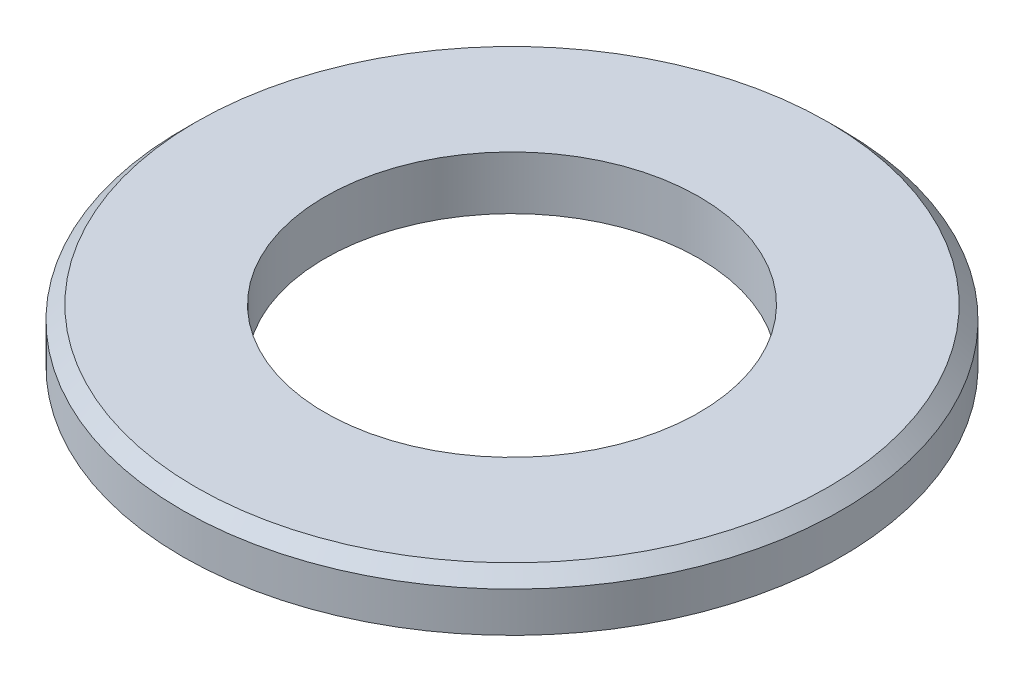
ISO-10303-21;
HEADER;
FILE_DESCRIPTION(('STEP AP214'),'2;1');
FILE_NAME('part.step','',(''),(''),'','','');
FILE_SCHEMA(('AUTOMOTIVE_DESIGN { 1 0 10303 214 1 1 1 1 }'));
ENDSEC;
DATA;
#1=APPLICATION_CONTEXT('core data for automotive mechanical design processes');
#2=APPLICATION_PROTOCOL_DEFINITION('international standard','automotive_design',2000,#1);
#3=PRODUCT_CONTEXT('',#1,'mechanical');
#4=PRODUCT('Part','Part','',(#3));
#5=PRODUCT_RELATED_PRODUCT_CATEGORY('part','',(#4));
#6=PRODUCT_DEFINITION_FORMATION('','',#4);
#7=PRODUCT_DEFINITION_CONTEXT('part definition',#1,'design');
#8=PRODUCT_DEFINITION('design','',#6,#7);
#9=PRODUCT_DEFINITION_SHAPE('','',#8);
#10=(LENGTH_UNIT() NAMED_UNIT(*) SI_UNIT(.MILLI.,.METRE.));
#11=(NAMED_UNIT(*) PLANE_ANGLE_UNIT() SI_UNIT($,.RADIAN.));
#12=(NAMED_UNIT(*) SI_UNIT($,.STERADIAN.) SOLID_ANGLE_UNIT());
#13=UNCERTAINTY_MEASURE_WITH_UNIT(LENGTH_MEASURE(1.E-05),#10,'distance_accuracy_value','');
#14=(GEOMETRIC_REPRESENTATION_CONTEXT(3) GLOBAL_UNCERTAINTY_ASSIGNED_CONTEXT((#13)) GLOBAL_UNIT_ASSIGNED_CONTEXT((#10,
#11,#12)) REPRESENTATION_CONTEXT('',''));
#15=CARTESIAN_POINT('',(0.,0.,0.));
#16=DIRECTION('',(0.,0.,1.));
#17=DIRECTION('',(1.,0.,0.));
#18=AXIS2_PLACEMENT_3D('',#15,#16,#17);
#19=CARTESIAN_POINT('',(0.,0.,0.));
#20=DIRECTION('',(0.,-1.,0.));
#21=DIRECTION('',(0.,0.,-1.));
#22=AXIS2_PLACEMENT_3D('',#19,#20,#21);
#23=CYLINDRICAL_SURFACE('',#22,10.5);
#24=CARTESIAN_POINT('',(0.,11.6445070422535,0.));
#25=DIRECTION('',(0.,-1.,0.));
#26=DIRECTION('',(0.,0.,-1.));
#27=AXIS2_PLACEMENT_3D('',#24,#25,#26);
#28=CIRCLE('',#27,10.5);
#29=CARTESIAN_POINT('',(0.,11.6445070422535,-10.5));
#30=VERTEX_POINT('',#29);
#31=EDGE_CURVE('E10',#30,#30,#28,.T.);
#32=ORIENTED_EDGE('',*,*,#31,.F.);
#33=EDGE_LOOP('',(#32));
#34=FACE_BOUND('',#33,.T.);
#35=CARTESIAN_POINT('',(0.,8.64450704225353,0.));
#36=DIRECTION('',(0.,-1.,0.));
#37=DIRECTION('',(0.,0.,-1.));
#38=AXIS2_PLACEMENT_3D('',#35,#36,#37);
#39=CIRCLE('',#38,10.5);
#40=CARTESIAN_POINT('',(0.,8.64450704225353,-10.5));
#41=VERTEX_POINT('',#40);
#42=EDGE_CURVE('E58',#41,#41,#39,.T.);
#43=ORIENTED_EDGE('',*,*,#42,.T.);
#44=EDGE_LOOP('',(#43));
#45=FACE_BOUND('',#44,.T.);
#46=ADVANCED_FACE('F39',(#34,#45),#23,.F.);
#47=CARTESIAN_POINT('',(-10.5,11.6445070422535,0.));
#48=DIRECTION('',(0.,-1.,0.));
#49=DIRECTION('',(0.,0.,-1.));
#50=AXIS2_PLACEMENT_3D('',#47,#48,#49);
#51=PLANE('',#50);
#52=CARTESIAN_POINT('',(0.,11.6445070422535,0.));
#53=DIRECTION('',(0.,-1.,0.));
#54=DIRECTION('',(0.,0.,-1.));
#55=AXIS2_PLACEMENT_3D('',#52,#53,#54);
#56=CIRCLE('',#55,17.75);
#57=CARTESIAN_POINT('',(0.,11.6445070422535,-17.75));
#58=VERTEX_POINT('',#57);
#59=EDGE_CURVE('E45',#58,#58,#56,.T.);
#60=ORIENTED_EDGE('',*,*,#59,.F.);
#61=EDGE_LOOP('',(#60));
#62=FACE_BOUND('',#61,.T.);
#63=ORIENTED_EDGE('',*,*,#31,.T.);
#64=EDGE_LOOP('',(#63));
#65=FACE_BOUND('',#64,.T.);
#66=ADVANCED_FACE('F77',(#62,#65),#51,.F.);
#67=CARTESIAN_POINT('',(0.,11.6445070422535,0.));
#68=DIRECTION('',(0.,-1.,0.));
#69=DIRECTION('',(0.,0.,-1.));
#70=AXIS2_PLACEMENT_3D('',#67,#68,#69);
#71=CONICAL_SURFACE('',#70,17.75,0.78539816339745);
#72=CARTESIAN_POINT('',(0.,10.8945070422535,0.));
#73=DIRECTION('',(0.,-1.,0.));
#74=DIRECTION('',(0.,0.,-1.));
#75=AXIS2_PLACEMENT_3D('',#72,#73,#74);
#76=CIRCLE('',#75,18.5);
#77=CARTESIAN_POINT('',(0.,10.8945070422535,-18.5));
#78=VERTEX_POINT('',#77);
#79=EDGE_CURVE('E49',#78,#78,#76,.T.);
#80=ORIENTED_EDGE('',*,*,#79,.F.);
#81=EDGE_LOOP('',(#80));
#82=FACE_BOUND('',#81,.T.);
#83=ORIENTED_EDGE('',*,*,#59,.T.);
#84=EDGE_LOOP('',(#83));
#85=FACE_BOUND('',#84,.T.);
#86=ADVANCED_FACE('F72',(#82,#85),#71,.T.);
#87=CARTESIAN_POINT('',(0.,0.,0.));
#88=DIRECTION('',(0.,-1.,0.));
#89=DIRECTION('',(0.,0.,-1.));
#90=AXIS2_PLACEMENT_3D('',#87,#88,#89);
#91=CYLINDRICAL_SURFACE('',#90,18.5);
#92=CARTESIAN_POINT('',(0.,8.64450704225353,0.));
#93=DIRECTION('',(0.,-1.,0.));
#94=DIRECTION('',(0.,0.,-1.));
#95=AXIS2_PLACEMENT_3D('',#92,#93,#94);
#96=CIRCLE('',#95,18.5);
#97=CARTESIAN_POINT('',(0.,8.64450704225353,-18.5));
#98=VERTEX_POINT('',#97);
#99=EDGE_CURVE('E53',#98,#98,#96,.T.);
#100=ORIENTED_EDGE('',*,*,#99,.F.);
#101=EDGE_LOOP('',(#100));
#102=FACE_BOUND('',#101,.T.);
#103=ORIENTED_EDGE('',*,*,#79,.T.);
#104=EDGE_LOOP('',(#103));
#105=FACE_BOUND('',#104,.T.);
#106=ADVANCED_FACE('F66',(#102,#105),#91,.T.);
#107=CARTESIAN_POINT('',(-10.5,8.64450704225353,0.));
#108=DIRECTION('',(0.,1.,0.));
#109=DIRECTION('',(0.,0.,1.));
#110=AXIS2_PLACEMENT_3D('',#107,#108,#109);
#111=PLANE('',#110);
#112=ORIENTED_EDGE('',*,*,#42,.F.);
#113=EDGE_LOOP('',(#112));
#114=FACE_BOUND('',#113,.T.);
#115=ORIENTED_EDGE('',*,*,#99,.T.);
#116=EDGE_LOOP('',(#115));
#117=FACE_BOUND('',#116,.T.);
#118=ADVANCED_FACE('F63',(#114,#117),#111,.F.);
#119=CLOSED_SHELL('',(#46,#66,#86,#106,#118));
#120=MANIFOLD_SOLID_BREP('B2',#119);
#121=ADVANCED_BREP_SHAPE_REPRESENTATION('',(#18,#120),#14);
#122=SHAPE_DEFINITION_REPRESENTATION(#9,#121);
ENDSEC;
END-ISO-10303-21;
